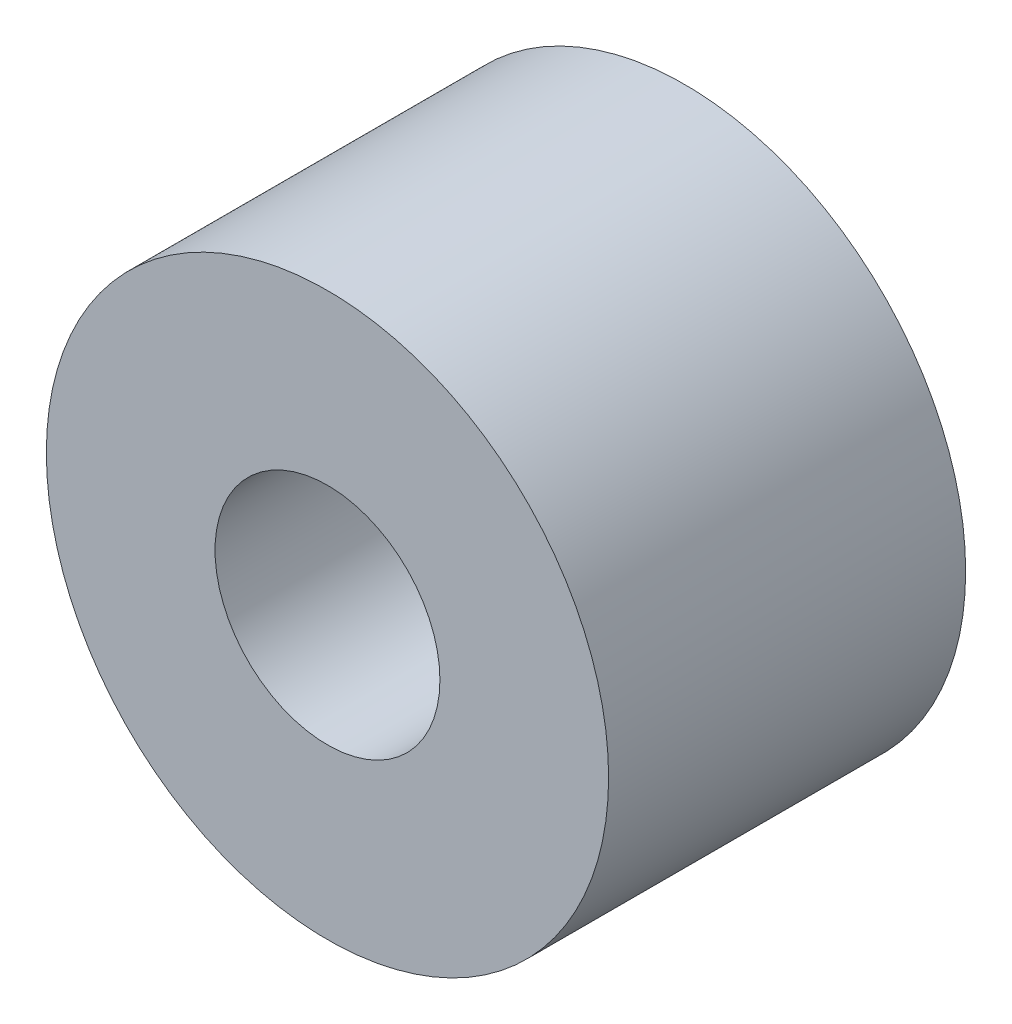
ISO-10303-21;
HEADER;
FILE_DESCRIPTION(('STEP AP214'),'2;1');
FILE_NAME('part.step','',(''),(''),'','','');
FILE_SCHEMA(('AUTOMOTIVE_DESIGN { 1 0 10303 214 1 1 1 1 }'));
ENDSEC;
DATA;
#1=APPLICATION_CONTEXT('core data for automotive mechanical design processes');
#2=APPLICATION_PROTOCOL_DEFINITION('international standard','automotive_design',2000,#1);
#3=PRODUCT_CONTEXT('',#1,'mechanical');
#4=PRODUCT('Part','Part','',(#3));
#5=PRODUCT_RELATED_PRODUCT_CATEGORY('part','',(#4));
#6=PRODUCT_DEFINITION_FORMATION('','',#4);
#7=PRODUCT_DEFINITION_CONTEXT('part definition',#1,'design');
#8=PRODUCT_DEFINITION('design','',#6,#7);
#9=PRODUCT_DEFINITION_SHAPE('','',#8);
#10=(LENGTH_UNIT() NAMED_UNIT(*) SI_UNIT(.MILLI.,.METRE.));
#11=(NAMED_UNIT(*) PLANE_ANGLE_UNIT() SI_UNIT($,.RADIAN.));
#12=(NAMED_UNIT(*) SI_UNIT($,.STERADIAN.) SOLID_ANGLE_UNIT());
#13=UNCERTAINTY_MEASURE_WITH_UNIT(LENGTH_MEASURE(1.E-05),#10,'distance_accuracy_value','');
#14=(GEOMETRIC_REPRESENTATION_CONTEXT(3) GLOBAL_UNCERTAINTY_ASSIGNED_CONTEXT((#13)) GLOBAL_UNIT_ASSIGNED_CONTEXT((#10,
#11,#12)) REPRESENTATION_CONTEXT('',''));
#15=CARTESIAN_POINT('',(0.,0.,0.));
#16=DIRECTION('',(0.,0.,1.));
#17=DIRECTION('',(1.,0.,0.));
#18=AXIS2_PLACEMENT_3D('',#15,#16,#17);
#19=CARTESIAN_POINT('',(0.,0.,6.35));
#20=DIRECTION('',(0.,0.,1.));
#21=DIRECTION('',(1.,0.,0.));
#22=AXIS2_PLACEMENT_3D('',#19,#20,#21);
#23=PLANE('',#22);
#24=CARTESIAN_POINT('',(0.,0.,6.35));
#25=DIRECTION('',(0.,0.,1.));
#26=DIRECTION('',(1.,0.,0.));
#27=AXIS2_PLACEMENT_3D('',#24,#25,#26);
#28=CIRCLE('',#27,5.);
#29=CARTESIAN_POINT('',(5.,0.,6.35));
#30=VERTEX_POINT('',#29);
#31=EDGE_CURVE('E10',#30,#30,#28,.T.);
#32=ORIENTED_EDGE('',*,*,#31,.T.);
#33=EDGE_LOOP('',(#32));
#34=FACE_BOUND('',#33,.T.);
#35=CARTESIAN_POINT('',(0.,0.,6.35));
#36=DIRECTION('',(0.,0.,1.));
#37=DIRECTION('',(1.,0.,0.));
#38=AXIS2_PLACEMENT_3D('',#35,#36,#37);
#39=CIRCLE('',#38,2.);
#40=CARTESIAN_POINT('',(2.,0.,6.35));
#41=VERTEX_POINT('',#40);
#42=EDGE_CURVE('E41',#41,#41,#39,.T.);
#43=ORIENTED_EDGE('',*,*,#42,.F.);
#44=EDGE_LOOP('',(#43));
#45=FACE_BOUND('',#44,.T.);
#46=ADVANCED_FACE('F30',(#34,#45),#23,.T.);
#47=CARTESIAN_POINT('',(0.,0.,0.));
#48=DIRECTION('',(0.,0.,1.));
#49=DIRECTION('',(1.,0.,0.));
#50=AXIS2_PLACEMENT_3D('',#47,#48,#49);
#51=PLANE('',#50);
#52=CARTESIAN_POINT('',(0.,0.,0.));
#53=DIRECTION('',(0.,0.,1.));
#54=DIRECTION('',(1.,0.,0.));
#55=AXIS2_PLACEMENT_3D('',#52,#53,#54);
#56=CIRCLE('',#55,5.);
#57=CARTESIAN_POINT('',(5.,0.,0.));
#58=VERTEX_POINT('',#57);
#59=EDGE_CURVE('E34',#58,#58,#56,.T.);
#60=ORIENTED_EDGE('',*,*,#59,.F.);
#61=EDGE_LOOP('',(#60));
#62=FACE_BOUND('',#61,.T.);
#63=CARTESIAN_POINT('',(0.,0.,0.));
#64=DIRECTION('',(0.,0.,1.));
#65=DIRECTION('',(1.,0.,0.));
#66=AXIS2_PLACEMENT_3D('',#63,#64,#65);
#67=CIRCLE('',#66,2.);
#68=CARTESIAN_POINT('',(2.,0.,0.));
#69=VERTEX_POINT('',#68);
#70=EDGE_CURVE('E43',#69,#69,#67,.T.);
#71=ORIENTED_EDGE('',*,*,#70,.T.);
#72=EDGE_LOOP('',(#71));
#73=FACE_BOUND('',#72,.T.);
#74=ADVANCED_FACE('F53',(#62,#73),#51,.F.);
#75=CARTESIAN_POINT('',(0.,0.,6.35));
#76=DIRECTION('',(0.,0.,-1.));
#77=DIRECTION('',(-1.,0.,0.));
#78=AXIS2_PLACEMENT_3D('',#75,#76,#77);
#79=CYLINDRICAL_SURFACE('',#78,5.);
#80=ORIENTED_EDGE('',*,*,#31,.F.);
#81=EDGE_LOOP('',(#80));
#82=FACE_BOUND('',#81,.T.);
#83=ORIENTED_EDGE('',*,*,#59,.T.);
#84=EDGE_LOOP('',(#83));
#85=FACE_BOUND('',#84,.T.);
#86=ADVANCED_FACE('F32',(#82,#85),#79,.T.);
#87=CARTESIAN_POINT('',(0.,0.,6.35));
#88=DIRECTION('',(0.,0.,-1.));
#89=DIRECTION('',(-1.,0.,0.));
#90=AXIS2_PLACEMENT_3D('',#87,#88,#89);
#91=CYLINDRICAL_SURFACE('',#90,2.);
#92=ORIENTED_EDGE('',*,*,#42,.T.);
#93=EDGE_LOOP('',(#92));
#94=FACE_BOUND('',#93,.T.);
#95=ORIENTED_EDGE('',*,*,#70,.F.);
#96=EDGE_LOOP('',(#95));
#97=FACE_BOUND('',#96,.T.);
#98=ADVANCED_FACE('F49',(#94,#97),#91,.F.);
#99=CLOSED_SHELL('',(#46,#74,#86,#98));
#100=MANIFOLD_SOLID_BREP('B2',#99);
#101=ADVANCED_BREP_SHAPE_REPRESENTATION('',(#18,#100),#14);
#102=SHAPE_DEFINITION_REPRESENTATION(#9,#101);
ENDSEC;
END-ISO-10303-21;
